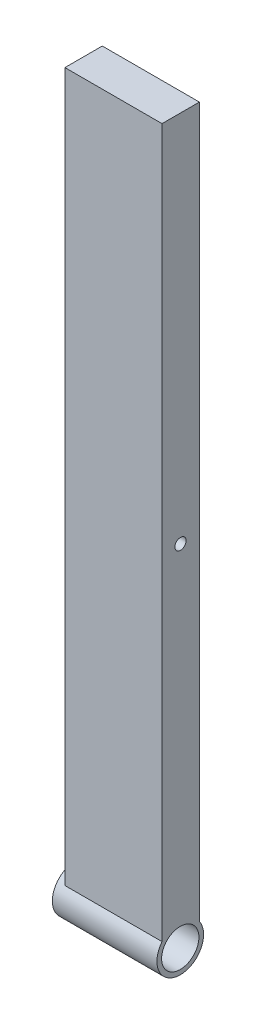
ISO-10303-21;
HEADER;
FILE_DESCRIPTION(('STEP AP214'),'2;1');
FILE_NAME('part.step','',(''),(''),'','','');
FILE_SCHEMA(('AUTOMOTIVE_DESIGN { 1 0 10303 214 1 1 1 1 }'));
ENDSEC;
DATA;
#1=APPLICATION_CONTEXT('core data for automotive mechanical design processes');
#2=APPLICATION_PROTOCOL_DEFINITION('international standard','automotive_design',2000,#1);
#3=PRODUCT_CONTEXT('',#1,'mechanical');
#4=PRODUCT('Part','Part','',(#3));
#5=PRODUCT_RELATED_PRODUCT_CATEGORY('part','',(#4));
#6=PRODUCT_DEFINITION_FORMATION('','',#4);
#7=PRODUCT_DEFINITION_CONTEXT('part definition',#1,'design');
#8=PRODUCT_DEFINITION('design','',#6,#7);
#9=PRODUCT_DEFINITION_SHAPE('','',#8);
#10=(LENGTH_UNIT() NAMED_UNIT(*) SI_UNIT(.MILLI.,.METRE.));
#11=(NAMED_UNIT(*) PLANE_ANGLE_UNIT() SI_UNIT($,.RADIAN.));
#12=(NAMED_UNIT(*) SI_UNIT($,.STERADIAN.) SOLID_ANGLE_UNIT());
#13=UNCERTAINTY_MEASURE_WITH_UNIT(LENGTH_MEASURE(1.E-05),#10,'distance_accuracy_value','');
#14=(GEOMETRIC_REPRESENTATION_CONTEXT(3) GLOBAL_UNCERTAINTY_ASSIGNED_CONTEXT((#13)) GLOBAL_UNIT_ASSIGNED_CONTEXT((#10,
#11,#12)) REPRESENTATION_CONTEXT('',''));
#15=CARTESIAN_POINT('',(0.,0.,0.));
#16=DIRECTION('',(0.,0.,1.));
#17=DIRECTION('',(1.,0.,0.));
#18=AXIS2_PLACEMENT_3D('',#15,#16,#17);
#19=CARTESIAN_POINT('',(-13.,190.,5.));
#20=DIRECTION('',(1.,0.,0.));
#21=DIRECTION('',(0.,0.,-1.));
#22=AXIS2_PLACEMENT_3D('',#19,#20,#21);
#23=PLANE('',#22);
#24=CARTESIAN_POINT('',(-13.,90.081616102456,0.0591793989538241));
#25=DIRECTION('',(1.,0.,0.));
#26=DIRECTION('',(0.,0.,-1.));
#27=AXIS2_PLACEMENT_3D('',#24,#25,#26);
#28=CIRCLE('',#27,1.5);
#29=CARTESIAN_POINT('',(-13.,90.081616102456,-1.44082060104618));
#30=VERTEX_POINT('',#29);
#31=EDGE_CURVE('E111',#30,#30,#28,.T.);
#32=ORIENTED_EDGE('',*,*,#31,.T.);
#33=EDGE_LOOP('',(#32));
#34=FACE_BOUND('',#33,.T.);
#35=DIRECTION('',(0.,-1.,0.));
#36=VECTOR('',#35,1.);
#37=CARTESIAN_POINT('',(-13.,190.,-5.));
#38=LINE('',#37,#36);
#39=CARTESIAN_POINT('',(-13.,190.,-5.));
#40=VERTEX_POINT('',#39);
#41=CARTESIAN_POINT('',(-13.,0.,-5.));
#42=VERTEX_POINT('',#41);
#43=EDGE_CURVE('E93',#40,#42,#38,.T.);
#44=ORIENTED_EDGE('',*,*,#43,.T.);
#45=CARTESIAN_POINT('',(-13.,-3.58676779508804,0.118358797907715));
#46=DIRECTION('',(1.,0.,0.));
#47=DIRECTION('',(0.,0.,-1.));
#48=AXIS2_PLACEMENT_3D('',#45,#46,#47);
#49=CIRCLE('',#48,6.25);
#50=CARTESIAN_POINT('',(-13.,0.31606184173125,5.));
#51=VERTEX_POINT('',#50);
#52=EDGE_CURVE('E88',#42,#51,#49,.T.);
#53=ORIENTED_EDGE('',*,*,#52,.T.);
#54=DIRECTION('',(0.,-1.,0.));
#55=VECTOR('',#54,1.);
#56=CARTESIAN_POINT('',(-13.,190.,5.));
#57=LINE('',#56,#55);
#58=CARTESIAN_POINT('',(-13.,190.,5.));
#59=VERTEX_POINT('',#58);
#60=EDGE_CURVE('E11',#59,#51,#57,.T.);
#61=ORIENTED_EDGE('',*,*,#60,.F.);
#62=DIRECTION('',(0.,0.,1.));
#63=VECTOR('',#62,1.);
#64=CARTESIAN_POINT('',(-13.,190.,5.));
#65=LINE('',#64,#63);
#66=EDGE_CURVE('E99',#40,#59,#65,.T.);
#67=ORIENTED_EDGE('',*,*,#66,.F.);
#68=EDGE_LOOP('',(#44,#53,#61,#67));
#69=FACE_BOUND('',#68,.T.);
#70=ADVANCED_FACE('F33',(#34,#69),#23,.F.);
#71=CARTESIAN_POINT('',(13.,190.,5.));
#72=DIRECTION('',(0.,0.,-1.));
#73=DIRECTION('',(-1.,0.,0.));
#74=AXIS2_PLACEMENT_3D('',#71,#72,#73);
#75=PLANE('',#74);
#76=ORIENTED_EDGE('',*,*,#60,.T.);
#77=DIRECTION('',(1.,0.,0.));
#78=VECTOR('',#77,1.);
#79=CARTESIAN_POINT('',(-15.,0.31606184173125,5.));
#80=LINE('',#79,#78);
#81=CARTESIAN_POINT('',(13.,0.316061841731254,5.));
#82=VERTEX_POINT('',#81);
#83=EDGE_CURVE('E72',#51,#82,#80,.T.);
#84=ORIENTED_EDGE('',*,*,#83,.T.);
#85=DIRECTION('',(0.,-1.,0.));
#86=VECTOR('',#85,1.);
#87=CARTESIAN_POINT('',(13.,190.,5.));
#88=LINE('',#87,#86);
#89=CARTESIAN_POINT('',(13.,190.,5.));
#90=VERTEX_POINT('',#89);
#91=EDGE_CURVE('E41',#90,#82,#88,.T.);
#92=ORIENTED_EDGE('',*,*,#91,.F.);
#93=DIRECTION('',(1.,0.,0.));
#94=VECTOR('',#93,1.);
#95=CARTESIAN_POINT('',(13.,190.,5.));
#96=LINE('',#95,#94);
#97=EDGE_CURVE('E102',#59,#90,#96,.T.);
#98=ORIENTED_EDGE('',*,*,#97,.F.);
#99=EDGE_LOOP('',(#76,#84,#92,#98));
#100=FACE_BOUND('',#99,.T.);
#101=ADVANCED_FACE('F85',(#100),#75,.F.);
#102=CARTESIAN_POINT('',(13.,190.,5.));
#103=DIRECTION('',(-1.,0.,0.));
#104=DIRECTION('',(0.,0.,1.));
#105=AXIS2_PLACEMENT_3D('',#102,#103,#104);
#106=PLANE('',#105);
#107=CARTESIAN_POINT('',(13.,90.081616102456,0.0591793989538241));
#108=DIRECTION('',(1.,0.,0.));
#109=DIRECTION('',(0.,0.,-1.));
#110=AXIS2_PLACEMENT_3D('',#107,#108,#109);
#111=CIRCLE('',#110,1.5);
#112=CARTESIAN_POINT('',(13.,90.081616102456,-1.44082060104618));
#113=VERTEX_POINT('',#112);
#114=EDGE_CURVE('E116',#113,#113,#111,.T.);
#115=ORIENTED_EDGE('',*,*,#114,.F.);
#116=EDGE_LOOP('',(#115));
#117=FACE_BOUND('',#116,.T.);
#118=CARTESIAN_POINT('',(13.,-3.58676779508804,0.118358797907715));
#119=DIRECTION('',(1.,0.,0.));
#120=DIRECTION('',(0.,0.,-1.));
#121=AXIS2_PLACEMENT_3D('',#118,#119,#120);
#122=CIRCLE('',#121,5.);
#123=CARTESIAN_POINT('',(13.,-3.58676779508804,-4.88164120209229));
#124=VERTEX_POINT('',#123);
#125=EDGE_CURVE('E108',#124,#124,#122,.T.);
#126=ORIENTED_EDGE('',*,*,#125,.F.);
#127=EDGE_LOOP('',(#126));
#128=FACE_BOUND('',#127,.T.);
#129=ORIENTED_EDGE('',*,*,#91,.T.);
#130=CARTESIAN_POINT('',(13.,-3.58676779508804,0.118358797907715));
#131=DIRECTION('',(1.,0.,0.));
#132=DIRECTION('',(0.,0.,-1.));
#133=AXIS2_PLACEMENT_3D('',#130,#131,#132);
#134=CIRCLE('',#133,6.25);
#135=CARTESIAN_POINT('',(13.,0.,-5.));
#136=VERTEX_POINT('',#135);
#137=EDGE_CURVE('E69',#82,#136,#134,.T.);
#138=ORIENTED_EDGE('',*,*,#137,.T.);
#139=DIRECTION('',(0.,-1.,0.));
#140=VECTOR('',#139,1.);
#141=CARTESIAN_POINT('',(13.,190.,-5.));
#142=LINE('',#141,#140);
#143=CARTESIAN_POINT('',(13.,190.,-5.));
#144=VERTEX_POINT('',#143);
#145=EDGE_CURVE('E92',#144,#136,#142,.T.);
#146=ORIENTED_EDGE('',*,*,#145,.F.);
#147=DIRECTION('',(0.,0.,-1.));
#148=VECTOR('',#147,1.);
#149=CARTESIAN_POINT('',(13.,190.,5.));
#150=LINE('',#149,#148);
#151=EDGE_CURVE('E91',#90,#144,#150,.T.);
#152=ORIENTED_EDGE('',*,*,#151,.F.);
#153=EDGE_LOOP('',(#129,#138,#146,#152));
#154=FACE_BOUND('',#153,.T.);
#155=ADVANCED_FACE('F90',(#117,#128,#154),#106,.F.);
#156=CARTESIAN_POINT('',(13.,190.,-5.));
#157=DIRECTION('',(0.,0.,1.));
#158=DIRECTION('',(1.,0.,0.));
#159=AXIS2_PLACEMENT_3D('',#156,#157,#158);
#160=PLANE('',#159);
#161=DIRECTION('',(-1.,0.,0.));
#162=VECTOR('',#161,1.);
#163=CARTESIAN_POINT('',(13.,0.,-5.));
#164=LINE('',#163,#162);
#165=EDGE_CURVE('E75',#136,#42,#164,.T.);
#166=ORIENTED_EDGE('',*,*,#165,.T.);
#167=ORIENTED_EDGE('',*,*,#43,.F.);
#168=DIRECTION('',(-1.,0.,0.));
#169=VECTOR('',#168,1.);
#170=CARTESIAN_POINT('',(13.,190.,-5.));
#171=LINE('',#170,#169);
#172=EDGE_CURVE('E48',#144,#40,#171,.T.);
#173=ORIENTED_EDGE('',*,*,#172,.F.);
#174=ORIENTED_EDGE('',*,*,#145,.T.);
#175=EDGE_LOOP('',(#166,#167,#173,#174));
#176=FACE_BOUND('',#175,.T.);
#177=ADVANCED_FACE('F125',(#176),#160,.F.);
#178=CARTESIAN_POINT('',(0.,190.,0.));
#179=DIRECTION('',(0.,1.,0.));
#180=DIRECTION('',(0.,0.,1.));
#181=AXIS2_PLACEMENT_3D('',#178,#179,#180);
#182=PLANE('',#181);
#183=ORIENTED_EDGE('',*,*,#66,.T.);
#184=ORIENTED_EDGE('',*,*,#97,.T.);
#185=ORIENTED_EDGE('',*,*,#151,.T.);
#186=ORIENTED_EDGE('',*,*,#172,.T.);
#187=EDGE_LOOP('',(#183,#184,#185,#186));
#188=FACE_BOUND('',#187,.T.);
#189=ADVANCED_FACE('F152',(#188),#182,.T.);
#190=CARTESIAN_POINT('',(-15.,-3.58676779508804,0.118358797907715));
#191=DIRECTION('',(1.,0.,0.));
#192=DIRECTION('',(0.,0.,-1.));
#193=AXIS2_PLACEMENT_3D('',#190,#191,#192);
#194=CYLINDRICAL_SURFACE('',#193,6.25);
#195=CARTESIAN_POINT('',(-15.,-3.58676779508804,0.118358797907715));
#196=DIRECTION('',(1.,0.,0.));
#197=DIRECTION('',(0.,0.,-1.));
#198=AXIS2_PLACEMENT_3D('',#195,#196,#197);
#199=CIRCLE('',#198,6.25);
#200=CARTESIAN_POINT('',(-15.,-3.58676779508804,-6.13164120209229));
#201=VERTEX_POINT('',#200);
#202=EDGE_CURVE('E80',#201,#201,#199,.T.);
#203=ORIENTED_EDGE('',*,*,#202,.T.);
#204=EDGE_LOOP('',(#203));
#205=FACE_BOUND('',#204,.T.);
#206=ORIENTED_EDGE('',*,*,#83,.F.);
#207=ORIENTED_EDGE('',*,*,#52,.F.);
#208=ORIENTED_EDGE('',*,*,#165,.F.);
#209=ORIENTED_EDGE('',*,*,#137,.F.);
#210=EDGE_LOOP('',(#206,#207,#208,#209));
#211=FACE_BOUND('',#210,.T.);
#212=ADVANCED_FACE('F71',(#205,#211),#194,.T.);
#213=CARTESIAN_POINT('',(-15.,-3.58676779508804,0.118358797907715));
#214=DIRECTION('',(1.,0.,0.));
#215=DIRECTION('',(0.,0.,-1.));
#216=AXIS2_PLACEMENT_3D('',#213,#214,#215);
#217=PLANE('',#216);
#218=CARTESIAN_POINT('',(-15.,-3.58676779508804,0.118358797907715));
#219=DIRECTION('',(1.,0.,0.));
#220=DIRECTION('',(0.,0.,-1.));
#221=AXIS2_PLACEMENT_3D('',#218,#219,#220);
#222=CIRCLE('',#221,5.);
#223=CARTESIAN_POINT('',(-15.,-3.58676779508804,-4.88164120209229));
#224=VERTEX_POINT('',#223);
#225=EDGE_CURVE('E81',#224,#224,#222,.T.);
#226=ORIENTED_EDGE('',*,*,#225,.T.);
#227=EDGE_LOOP('',(#226));
#228=FACE_BOUND('',#227,.T.);
#229=ORIENTED_EDGE('',*,*,#202,.F.);
#230=EDGE_LOOP('',(#229));
#231=FACE_BOUND('',#230,.T.);
#232=ADVANCED_FACE('F131',(#228,#231),#217,.F.);
#233=CARTESIAN_POINT('',(-15.,-3.58676779508804,0.118358797907715));
#234=DIRECTION('',(1.,0.,0.));
#235=DIRECTION('',(0.,0.,-1.));
#236=AXIS2_PLACEMENT_3D('',#233,#234,#235);
#237=CYLINDRICAL_SURFACE('',#236,5.);
#238=ORIENTED_EDGE('',*,*,#225,.F.);
#239=EDGE_LOOP('',(#238));
#240=FACE_BOUND('',#239,.T.);
#241=ORIENTED_EDGE('',*,*,#125,.T.);
#242=EDGE_LOOP('',(#241));
#243=FACE_BOUND('',#242,.T.);
#244=ADVANCED_FACE('F129',(#240,#243),#237,.F.);
#245=CARTESIAN_POINT('',(-15.,90.081616102456,0.0591793989538241));
#246=DIRECTION('',(1.,0.,0.));
#247=DIRECTION('',(0.,0.,-1.));
#248=AXIS2_PLACEMENT_3D('',#245,#246,#247);
#249=CYLINDRICAL_SURFACE('',#248,1.5);
#250=ORIENTED_EDGE('',*,*,#114,.T.);
#251=EDGE_LOOP('',(#250));
#252=FACE_BOUND('',#251,.T.);
#253=ORIENTED_EDGE('',*,*,#31,.F.);
#254=EDGE_LOOP('',(#253));
#255=FACE_BOUND('',#254,.T.);
#256=ADVANCED_FACE('F120',(#252,#255),#249,.F.);
#257=CLOSED_SHELL('',(#70,#101,#155,#177,#189,#212,#232,#244,#256));
#258=MANIFOLD_SOLID_BREP('B2',#257);
#259=ADVANCED_BREP_SHAPE_REPRESENTATION('',(#18,#258),#14);
#260=SHAPE_DEFINITION_REPRESENTATION(#9,#259);
ENDSEC;
END-ISO-10303-21;
